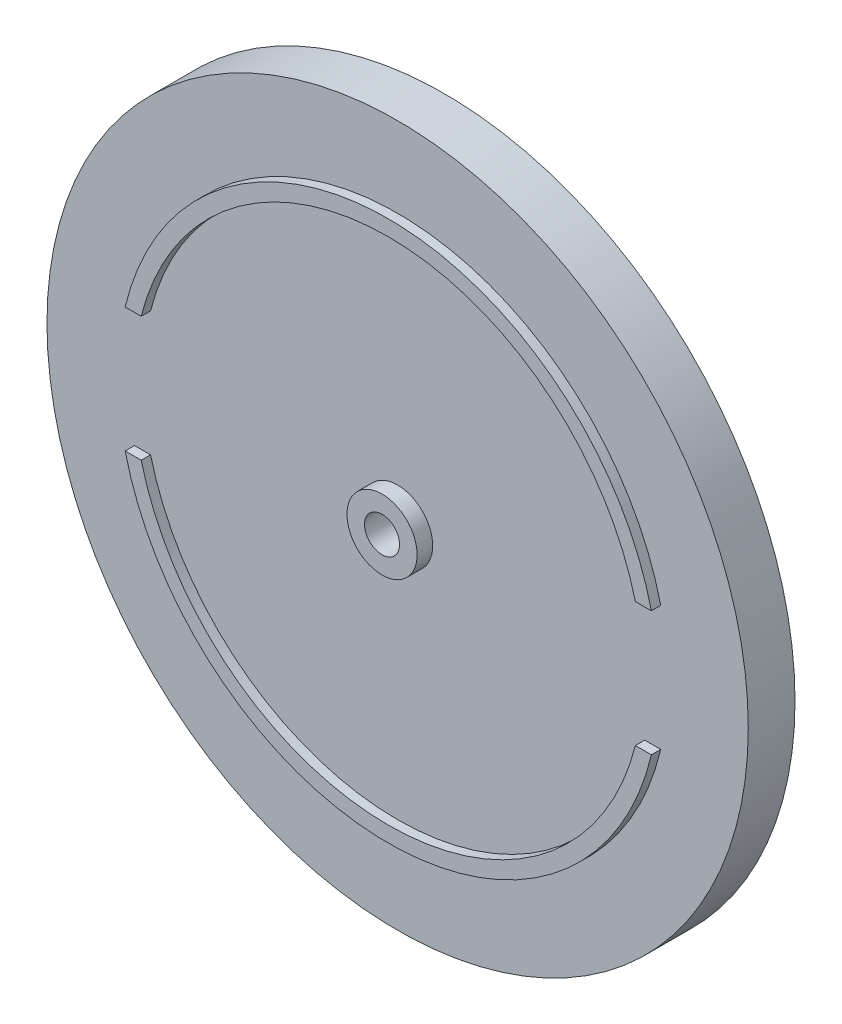
ISO-10303-21;
HEADER;
FILE_DESCRIPTION(('STEP AP214'),'2;1');
FILE_NAME('part.step','',(''),(''),'','','');
FILE_SCHEMA(('AUTOMOTIVE_DESIGN { 1 0 10303 214 1 1 1 1 }'));
ENDSEC;
DATA;
#1=APPLICATION_CONTEXT('core data for automotive mechanical design processes');
#2=APPLICATION_PROTOCOL_DEFINITION('international standard','automotive_design',2000,#1);
#3=PRODUCT_CONTEXT('',#1,'mechanical');
#4=PRODUCT('Part','Part','',(#3));
#5=PRODUCT_RELATED_PRODUCT_CATEGORY('part','',(#4));
#6=PRODUCT_DEFINITION_FORMATION('','',#4);
#7=PRODUCT_DEFINITION_CONTEXT('part definition',#1,'design');
#8=PRODUCT_DEFINITION('design','',#6,#7);
#9=PRODUCT_DEFINITION_SHAPE('','',#8);
#10=(LENGTH_UNIT() NAMED_UNIT(*) SI_UNIT(.MILLI.,.METRE.));
#11=(NAMED_UNIT(*) PLANE_ANGLE_UNIT() SI_UNIT($,.RADIAN.));
#12=(NAMED_UNIT(*) SI_UNIT($,.STERADIAN.) SOLID_ANGLE_UNIT());
#13=UNCERTAINTY_MEASURE_WITH_UNIT(LENGTH_MEASURE(1.E-05),#10,'distance_accuracy_value','');
#14=(GEOMETRIC_REPRESENTATION_CONTEXT(3) GLOBAL_UNCERTAINTY_ASSIGNED_CONTEXT((#13)) GLOBAL_UNIT_ASSIGNED_CONTEXT((#10,
#11,#12)) REPRESENTATION_CONTEXT('',''));
#15=CARTESIAN_POINT('',(0.,0.,0.));
#16=DIRECTION('',(0.,0.,1.));
#17=DIRECTION('',(1.,0.,0.));
#18=AXIS2_PLACEMENT_3D('',#15,#16,#17);
#19=CARTESIAN_POINT('',(0.,0.,-1.));
#20=DIRECTION('',(0.,0.,1.));
#21=DIRECTION('',(1.,0.,0.));
#22=AXIS2_PLACEMENT_3D('',#19,#20,#21);
#23=CYLINDRICAL_SURFACE('',#22,2.25);
#24=CARTESIAN_POINT('',(0.,0.,8.));
#25=DIRECTION('',(0.,0.,1.));
#26=DIRECTION('',(1.,0.,0.));
#27=AXIS2_PLACEMENT_3D('',#24,#25,#26);
#28=CIRCLE('',#27,2.25);
#29=CARTESIAN_POINT('',(2.25,0.,8.));
#30=VERTEX_POINT('',#29);
#31=EDGE_CURVE('E22',#30,#30,#28,.T.);
#32=ORIENTED_EDGE('',*,*,#31,.T.);
#33=EDGE_LOOP('',(#32));
#34=FACE_BOUND('',#33,.T.);
#35=CARTESIAN_POINT('',(0.,0.,4.2));
#36=DIRECTION('',(0.,0.,1.));
#37=DIRECTION('',(1.,0.,0.));
#38=AXIS2_PLACEMENT_3D('',#35,#36,#37);
#39=CIRCLE('',#38,2.25);
#40=CARTESIAN_POINT('',(2.25,0.,4.2));
#41=VERTEX_POINT('',#40);
#42=EDGE_CURVE('E9',#41,#41,#39,.T.);
#43=ORIENTED_EDGE('',*,*,#42,.F.);
#44=EDGE_LOOP('',(#43));
#45=FACE_BOUND('',#44,.T.);
#46=ADVANCED_FACE('F14',(#34,#45),#23,.F.);
#47=CARTESIAN_POINT('',(0.,0.,4.2));
#48=DIRECTION('',(0.,0.,1.));
#49=DIRECTION('',(1.,0.,0.));
#50=AXIS2_PLACEMENT_3D('',#47,#48,#49);
#51=PLANE('',#50);
#52=ORIENTED_EDGE('',*,*,#42,.T.);
#53=EDGE_LOOP('',(#52));
#54=FACE_BOUND('',#53,.T.);
#55=CARTESIAN_POINT('',(0.,0.,4.2));
#56=DIRECTION('',(0.,0.,1.));
#57=DIRECTION('',(1.,0.,0.));
#58=AXIS2_PLACEMENT_3D('',#55,#56,#57);
#59=CIRCLE('',#58,4.7);
#60=CARTESIAN_POINT('',(4.7,0.,4.2));
#61=VERTEX_POINT('',#60);
#62=EDGE_CURVE('E201',#61,#61,#59,.T.);
#63=ORIENTED_EDGE('',*,*,#62,.F.);
#64=EDGE_LOOP('',(#63));
#65=FACE_BOUND('',#64,.T.);
#66=ADVANCED_FACE('F276',(#54,#65),#51,.F.);
#67=CARTESIAN_POINT('',(0.,0.,7.2));
#68=DIRECTION('',(0.,0.,1.));
#69=DIRECTION('',(1.,0.,0.));
#70=AXIS2_PLACEMENT_3D('',#67,#68,#69);
#71=PLANE('',#70);
#72=DIRECTION('',(-1.,0.,0.));
#73=VECTOR('',#72,1.);
#74=CARTESIAN_POINT('',(-20.,8.,7.2));
#75=LINE('',#74,#73);
#76=CARTESIAN_POINT('',(33.765218790939,8.,7.2));
#77=VERTEX_POINT('',#76);
#78=CARTESIAN_POINT('',(31.706308520545,8.,7.2));
#79=VERTEX_POINT('',#78);
#80=EDGE_CURVE('E196',#77,#79,#75,.T.);
#81=ORIENTED_EDGE('',*,*,#80,.F.);
#82=CARTESIAN_POINT('',(0.,0.,7.2));
#83=DIRECTION('',(0.,0.,1.));
#84=DIRECTION('',(1.,0.,0.));
#85=AXIS2_PLACEMENT_3D('',#82,#83,#84);
#86=CIRCLE('',#85,34.7);
#87=CARTESIAN_POINT('',(-33.76521879093,8.,7.2));
#88=VERTEX_POINT('',#87);
#89=EDGE_CURVE('E137',#77,#88,#86,.T.);
#90=ORIENTED_EDGE('',*,*,#89,.T.);
#91=DIRECTION('',(-1.,0.,0.));
#92=VECTOR('',#91,1.);
#93=CARTESIAN_POINT('',(-20.,8.,7.2));
#94=LINE('',#93,#92);
#95=CARTESIAN_POINT('',(-31.70630852054,8.,7.2));
#96=VERTEX_POINT('',#95);
#97=EDGE_CURVE('E208',#96,#88,#94,.T.);
#98=ORIENTED_EDGE('',*,*,#97,.F.);
#99=CARTESIAN_POINT('',(0.,0.,7.2));
#100=DIRECTION('',(0.,0.,1.));
#101=DIRECTION('',(1.,0.,0.));
#102=AXIS2_PLACEMENT_3D('',#99,#100,#101);
#103=CIRCLE('',#102,32.7);
#104=EDGE_CURVE('E34',#79,#96,#103,.T.);
#105=ORIENTED_EDGE('',*,*,#104,.F.);
#106=EDGE_LOOP('',(#81,#90,#98,#105));
#107=FACE_BOUND('',#106,.T.);
#108=ADVANCED_FACE('F222',(#107),#71,.T.);
#109=CARTESIAN_POINT('',(0.,0.,8.));
#110=DIRECTION('',(0.,0.,1.));
#111=DIRECTION('',(1.,0.,0.));
#112=AXIS2_PLACEMENT_3D('',#109,#110,#111);
#113=PLANE('',#112);
#114=ORIENTED_EDGE('',*,*,#31,.F.);
#115=EDGE_LOOP('',(#114));
#116=FACE_BOUND('',#115,.T.);
#117=CARTESIAN_POINT('',(0.,0.,8.));
#118=DIRECTION('',(0.,0.,1.));
#119=DIRECTION('',(1.,0.,0.));
#120=AXIS2_PLACEMENT_3D('',#117,#118,#119);
#121=CIRCLE('',#120,4.5);
#122=CARTESIAN_POINT('',(4.5,0.,8.));
#123=VERTEX_POINT('',#122);
#124=EDGE_CURVE('E134',#123,#123,#121,.T.);
#125=ORIENTED_EDGE('',*,*,#124,.T.);
#126=EDGE_LOOP('',(#125));
#127=FACE_BOUND('',#126,.T.);
#128=ADVANCED_FACE('F219',(#116,#127),#113,.T.);
#129=CARTESIAN_POINT('',(0.,0.,7.2));
#130=DIRECTION('',(0.,0.,1.));
#131=DIRECTION('',(1.,0.,0.));
#132=AXIS2_PLACEMENT_3D('',#129,#130,#131);
#133=PLANE('',#132);
#134=CARTESIAN_POINT('',(0.,0.,7.2));
#135=DIRECTION('',(0.,0.,1.));
#136=DIRECTION('',(1.,0.,0.));
#137=AXIS2_PLACEMENT_3D('',#134,#135,#136);
#138=CIRCLE('',#137,34.7);
#139=CARTESIAN_POINT('',(-33.76521879093,-8.,7.2));
#140=VERTEX_POINT('',#139);
#141=CARTESIAN_POINT('',(33.765218790939,-8.,7.2));
#142=VERTEX_POINT('',#141);
#143=EDGE_CURVE('E103',#140,#142,#138,.T.);
#144=ORIENTED_EDGE('',*,*,#143,.T.);
#145=DIRECTION('',(-1.,0.,0.));
#146=VECTOR('',#145,1.);
#147=CARTESIAN_POINT('',(-20.,-8.,7.2));
#148=LINE('',#147,#146);
#149=CARTESIAN_POINT('',(31.706308520545,-8.,7.2));
#150=VERTEX_POINT('',#149);
#151=EDGE_CURVE('E154',#142,#150,#148,.T.);
#152=ORIENTED_EDGE('',*,*,#151,.T.);
#153=CARTESIAN_POINT('',(0.,0.,7.2));
#154=DIRECTION('',(0.,0.,1.));
#155=DIRECTION('',(1.,0.,0.));
#156=AXIS2_PLACEMENT_3D('',#153,#154,#155);
#157=CIRCLE('',#156,32.7);
#158=CARTESIAN_POINT('',(-31.70630852054,-8.,7.2));
#159=VERTEX_POINT('',#158);
#160=EDGE_CURVE('E105',#159,#150,#157,.T.);
#161=ORIENTED_EDGE('',*,*,#160,.F.);
#162=DIRECTION('',(-1.,0.,0.));
#163=VECTOR('',#162,1.);
#164=CARTESIAN_POINT('',(-20.,-8.,7.2));
#165=LINE('',#164,#163);
#166=EDGE_CURVE('E98',#159,#140,#165,.T.);
#167=ORIENTED_EDGE('',*,*,#166,.T.);
#168=EDGE_LOOP('',(#144,#152,#161,#167));
#169=FACE_BOUND('',#168,.T.);
#170=ADVANCED_FACE('F100',(#169),#133,.T.);
#171=CARTESIAN_POINT('',(0.,0.,-0.1));
#172=DIRECTION('',(0.,0.,1.));
#173=DIRECTION('',(1.,0.,0.));
#174=AXIS2_PLACEMENT_3D('',#171,#172,#173);
#175=CYLINDRICAL_SURFACE('',#174,4.7);
#176=ORIENTED_EDGE('',*,*,#62,.T.);
#177=EDGE_LOOP('',(#176));
#178=FACE_BOUND('',#177,.T.);
#179=CARTESIAN_POINT('',(0.,0.,0.));
#180=DIRECTION('',(0.,0.,1.));
#181=DIRECTION('',(1.,0.,0.));
#182=AXIS2_PLACEMENT_3D('',#179,#180,#181);
#183=CIRCLE('',#182,4.7);
#184=CARTESIAN_POINT('',(4.7,0.,0.));
#185=VERTEX_POINT('',#184);
#186=EDGE_CURVE('E129',#185,#185,#183,.T.);
#187=ORIENTED_EDGE('',*,*,#186,.F.);
#188=EDGE_LOOP('',(#187));
#189=FACE_BOUND('',#188,.T.);
#190=ADVANCED_FACE('F289',(#178,#189),#175,.F.);
#191=CARTESIAN_POINT('',(0.,0.,5.9));
#192=DIRECTION('',(0.,0.,1.));
#193=DIRECTION('',(1.,0.,0.));
#194=AXIS2_PLACEMENT_3D('',#191,#192,#193);
#195=CYLINDRICAL_SURFACE('',#194,32.7);
#196=DIRECTION('',(0.,0.,1.));
#197=VECTOR('',#196,1.);
#198=CARTESIAN_POINT('',(-31.70630852054,8.,5.9));
#199=LINE('',#198,#197);
#200=CARTESIAN_POINT('',(-31.70630852054,8.,6.));
#201=VERTEX_POINT('',#200);
#202=EDGE_CURVE('E207',#201,#96,#199,.T.);
#203=ORIENTED_EDGE('',*,*,#202,.F.);
#204=CARTESIAN_POINT('',(0.,0.,6.));
#205=DIRECTION('',(0.,0.,1.));
#206=DIRECTION('',(1.,0.,0.));
#207=AXIS2_PLACEMENT_3D('',#204,#205,#206);
#208=CIRCLE('',#207,32.7);
#209=CARTESIAN_POINT('',(31.706308520545,8.,6.));
#210=VERTEX_POINT('',#209);
#211=EDGE_CURVE('E159',#210,#201,#208,.T.);
#212=ORIENTED_EDGE('',*,*,#211,.F.);
#213=DIRECTION('',(0.,0.,1.));
#214=VECTOR('',#213,1.);
#215=CARTESIAN_POINT('',(31.706308520545,8.,5.9));
#216=LINE('',#215,#214);
#217=EDGE_CURVE('E200',#210,#79,#216,.T.);
#218=ORIENTED_EDGE('',*,*,#217,.T.);
#219=ORIENTED_EDGE('',*,*,#104,.T.);
#220=EDGE_LOOP('',(#203,#212,#218,#219));
#221=FACE_BOUND('',#220,.T.);
#222=ADVANCED_FACE('F259',(#221),#195,.F.);
#223=CARTESIAN_POINT('',(-40.,8.,5.9));
#224=DIRECTION('',(0.,1.,0.));
#225=DIRECTION('',(1.,0.,0.));
#226=AXIS2_PLACEMENT_3D('',#223,#224,#225);
#227=PLANE('',#226);
#228=ORIENTED_EDGE('',*,*,#202,.T.);
#229=ORIENTED_EDGE('',*,*,#97,.T.);
#230=DIRECTION('',(0.,0.,1.));
#231=VECTOR('',#230,1.);
#232=CARTESIAN_POINT('',(-33.76521879093,8.,6.));
#233=LINE('',#232,#231);
#234=CARTESIAN_POINT('',(-33.76521879093,8.,6.));
#235=VERTEX_POINT('',#234);
#236=EDGE_CURVE('E192',#235,#88,#233,.T.);
#237=ORIENTED_EDGE('',*,*,#236,.F.);
#238=DIRECTION('',(-1.,0.,0.));
#239=VECTOR('',#238,1.);
#240=CARTESIAN_POINT('',(-20.,8.,6.));
#241=LINE('',#240,#239);
#242=EDGE_CURVE('E163',#201,#235,#241,.T.);
#243=ORIENTED_EDGE('',*,*,#242,.F.);
#244=EDGE_LOOP('',(#228,#229,#237,#243));
#245=FACE_BOUND('',#244,.T.);
#246=ADVANCED_FACE('F257',(#245),#227,.F.);
#247=CARTESIAN_POINT('',(-40.,8.,5.9));
#248=DIRECTION('',(0.,1.,0.));
#249=DIRECTION('',(1.,0.,0.));
#250=AXIS2_PLACEMENT_3D('',#247,#248,#249);
#251=PLANE('',#250);
#252=ORIENTED_EDGE('',*,*,#80,.T.);
#253=ORIENTED_EDGE('',*,*,#217,.F.);
#254=DIRECTION('',(-1.,0.,0.));
#255=VECTOR('',#254,1.);
#256=CARTESIAN_POINT('',(-20.,8.,6.));
#257=LINE('',#256,#255);
#258=CARTESIAN_POINT('',(33.765218790939,8.,6.));
#259=VERTEX_POINT('',#258);
#260=EDGE_CURVE('E164',#259,#210,#257,.T.);
#261=ORIENTED_EDGE('',*,*,#260,.F.);
#262=DIRECTION('',(0.,0.,1.));
#263=VECTOR('',#262,1.);
#264=CARTESIAN_POINT('',(33.765218790939,8.,6.));
#265=LINE('',#264,#263);
#266=EDGE_CURVE('E188',#259,#77,#265,.T.);
#267=ORIENTED_EDGE('',*,*,#266,.T.);
#268=EDGE_LOOP('',(#252,#253,#261,#267));
#269=FACE_BOUND('',#268,.T.);
#270=ADVANCED_FACE('F263',(#269),#251,.F.);
#271=CARTESIAN_POINT('',(0.,0.,6.));
#272=DIRECTION('',(0.,0.,1.));
#273=DIRECTION('',(1.,0.,0.));
#274=AXIS2_PLACEMENT_3D('',#271,#272,#273);
#275=CYLINDRICAL_SURFACE('',#274,34.7);
#276=ORIENTED_EDGE('',*,*,#89,.F.);
#277=ORIENTED_EDGE('',*,*,#266,.F.);
#278=CARTESIAN_POINT('',(0.,0.,6.));
#279=DIRECTION('',(0.,0.,1.));
#280=DIRECTION('',(1.,0.,0.));
#281=AXIS2_PLACEMENT_3D('',#278,#279,#280);
#282=CIRCLE('',#281,34.7);
#283=EDGE_CURVE('E158',#259,#235,#282,.T.);
#284=ORIENTED_EDGE('',*,*,#283,.T.);
#285=ORIENTED_EDGE('',*,*,#236,.T.);
#286=EDGE_LOOP('',(#276,#277,#284,#285));
#287=FACE_BOUND('',#286,.T.);
#288=ADVANCED_FACE('F230',(#287),#275,.T.);
#289=CARTESIAN_POINT('',(0.,0.,6.));
#290=DIRECTION('',(0.,0.,1.));
#291=DIRECTION('',(1.,0.,0.));
#292=AXIS2_PLACEMENT_3D('',#289,#290,#291);
#293=CYLINDRICAL_SURFACE('',#292,4.5);
#294=ORIENTED_EDGE('',*,*,#124,.F.);
#295=EDGE_LOOP('',(#294));
#296=FACE_BOUND('',#295,.T.);
#297=CARTESIAN_POINT('',(0.,0.,6.));
#298=DIRECTION('',(0.,0.,1.));
#299=DIRECTION('',(1.,0.,0.));
#300=AXIS2_PLACEMENT_3D('',#297,#298,#299);
#301=CIRCLE('',#300,4.5);
#302=CARTESIAN_POINT('',(4.5,0.,6.));
#303=VERTEX_POINT('',#302);
#304=EDGE_CURVE('E145',#303,#303,#301,.T.);
#305=ORIENTED_EDGE('',*,*,#304,.T.);
#306=EDGE_LOOP('',(#305));
#307=FACE_BOUND('',#306,.T.);
#308=ADVANCED_FACE('F226',(#296,#307),#293,.T.);
#309=CARTESIAN_POINT('',(0.,0.,5.9));
#310=DIRECTION('',(0.,0.,1.));
#311=DIRECTION('',(1.,0.,0.));
#312=AXIS2_PLACEMENT_3D('',#309,#310,#311);
#313=CYLINDRICAL_SURFACE('',#312,32.7);
#314=CARTESIAN_POINT('',(0.,0.,6.));
#315=DIRECTION('',(0.,0.,1.));
#316=DIRECTION('',(1.,0.,0.));
#317=AXIS2_PLACEMENT_3D('',#314,#315,#316);
#318=CIRCLE('',#317,32.7);
#319=CARTESIAN_POINT('',(-31.70630852054,-8.,6.));
#320=VERTEX_POINT('',#319);
#321=CARTESIAN_POINT('',(31.706308520545,-8.,6.));
#322=VERTEX_POINT('',#321);
#323=EDGE_CURVE('E146',#320,#322,#318,.T.);
#324=ORIENTED_EDGE('',*,*,#323,.F.);
#325=DIRECTION('',(0.,0.,1.));
#326=VECTOR('',#325,1.);
#327=CARTESIAN_POINT('',(-31.70630852054,-8.,5.9));
#328=LINE('',#327,#326);
#329=EDGE_CURVE('E109',#320,#159,#328,.T.);
#330=ORIENTED_EDGE('',*,*,#329,.T.);
#331=ORIENTED_EDGE('',*,*,#160,.T.);
#332=DIRECTION('',(0.,0.,1.));
#333=VECTOR('',#332,1.);
#334=CARTESIAN_POINT('',(31.706308520545,-8.,5.9));
#335=LINE('',#334,#333);
#336=EDGE_CURVE('E179',#322,#150,#335,.T.);
#337=ORIENTED_EDGE('',*,*,#336,.F.);
#338=EDGE_LOOP('',(#324,#330,#331,#337));
#339=FACE_BOUND('',#338,.T.);
#340=ADVANCED_FACE('F229',(#339),#313,.F.);
#341=CARTESIAN_POINT('',(-40.,-8.,5.9));
#342=DIRECTION('',(0.,1.,0.));
#343=DIRECTION('',(1.,0.,0.));
#344=AXIS2_PLACEMENT_3D('',#341,#342,#343);
#345=PLANE('',#344);
#346=DIRECTION('',(0.,0.,1.));
#347=VECTOR('',#346,1.);
#348=CARTESIAN_POINT('',(33.765218790939,-8.,6.));
#349=LINE('',#348,#347);
#350=CARTESIAN_POINT('',(33.765218790939,-8.,6.));
#351=VERTEX_POINT('',#350);
#352=EDGE_CURVE('E122',#351,#142,#349,.T.);
#353=ORIENTED_EDGE('',*,*,#352,.F.);
#354=DIRECTION('',(-1.,0.,0.));
#355=VECTOR('',#354,1.);
#356=CARTESIAN_POINT('',(-20.,-8.,6.));
#357=LINE('',#356,#355);
#358=EDGE_CURVE('E141',#351,#322,#357,.T.);
#359=ORIENTED_EDGE('',*,*,#358,.T.);
#360=ORIENTED_EDGE('',*,*,#336,.T.);
#361=ORIENTED_EDGE('',*,*,#151,.F.);
#362=EDGE_LOOP('',(#353,#359,#360,#361));
#363=FACE_BOUND('',#362,.T.);
#364=ADVANCED_FACE('F295',(#363),#345,.T.);
#365=CARTESIAN_POINT('',(-40.,-8.,5.9));
#366=DIRECTION('',(0.,1.,0.));
#367=DIRECTION('',(1.,0.,0.));
#368=AXIS2_PLACEMENT_3D('',#365,#366,#367);
#369=PLANE('',#368);
#370=DIRECTION('',(-1.,0.,0.));
#371=VECTOR('',#370,1.);
#372=CARTESIAN_POINT('',(-20.,-8.,6.));
#373=LINE('',#372,#371);
#374=CARTESIAN_POINT('',(-33.76521879093,-8.,6.));
#375=VERTEX_POINT('',#374);
#376=EDGE_CURVE('E115',#320,#375,#373,.T.);
#377=ORIENTED_EDGE('',*,*,#376,.T.);
#378=DIRECTION('',(0.,0.,1.));
#379=VECTOR('',#378,1.);
#380=CARTESIAN_POINT('',(-33.76521879093,-8.,6.));
#381=LINE('',#380,#379);
#382=EDGE_CURVE('E110',#375,#140,#381,.T.);
#383=ORIENTED_EDGE('',*,*,#382,.T.);
#384=ORIENTED_EDGE('',*,*,#166,.F.);
#385=ORIENTED_EDGE('',*,*,#329,.F.);
#386=EDGE_LOOP('',(#377,#383,#384,#385));
#387=FACE_BOUND('',#386,.T.);
#388=ADVANCED_FACE('F113',(#387),#369,.T.);
#389=CARTESIAN_POINT('',(0.,0.,6.));
#390=DIRECTION('',(0.,0.,1.));
#391=DIRECTION('',(1.,0.,0.));
#392=AXIS2_PLACEMENT_3D('',#389,#390,#391);
#393=CYLINDRICAL_SURFACE('',#392,34.7);
#394=ORIENTED_EDGE('',*,*,#352,.T.);
#395=ORIENTED_EDGE('',*,*,#143,.F.);
#396=ORIENTED_EDGE('',*,*,#382,.F.);
#397=CARTESIAN_POINT('',(0.,0.,6.));
#398=DIRECTION('',(0.,0.,1.));
#399=DIRECTION('',(1.,0.,0.));
#400=AXIS2_PLACEMENT_3D('',#397,#398,#399);
#401=CIRCLE('',#400,34.7);
#402=EDGE_CURVE('E138',#375,#351,#401,.T.);
#403=ORIENTED_EDGE('',*,*,#402,.T.);
#404=EDGE_LOOP('',(#394,#395,#396,#403));
#405=FACE_BOUND('',#404,.T.);
#406=ADVANCED_FACE('F121',(#405),#393,.T.);
#407=CARTESIAN_POINT('',(0.,0.,0.));
#408=DIRECTION('',(0.,0.,1.));
#409=DIRECTION('',(1.,0.,0.));
#410=AXIS2_PLACEMENT_3D('',#407,#408,#409);
#411=PLANE('',#410);
#412=ORIENTED_EDGE('',*,*,#186,.T.);
#413=EDGE_LOOP('',(#412));
#414=FACE_BOUND('',#413,.T.);
#415=CARTESIAN_POINT('',(0.,0.,0.));
#416=DIRECTION('',(0.,0.,1.));
#417=DIRECTION('',(1.,0.,0.));
#418=AXIS2_PLACEMENT_3D('',#415,#416,#417);
#419=CIRCLE('',#418,45.);
#420=CARTESIAN_POINT('',(45.,0.,0.));
#421=VERTEX_POINT('',#420);
#422=EDGE_CURVE('E133',#421,#421,#419,.T.);
#423=ORIENTED_EDGE('',*,*,#422,.F.);
#424=EDGE_LOOP('',(#423));
#425=FACE_BOUND('',#424,.T.);
#426=ADVANCED_FACE('F238',(#414,#425),#411,.F.);
#427=CARTESIAN_POINT('',(0.,0.,6.));
#428=DIRECTION('',(0.,0.,1.));
#429=DIRECTION('',(1.,0.,0.));
#430=AXIS2_PLACEMENT_3D('',#427,#428,#429);
#431=PLANE('',#430);
#432=ORIENTED_EDGE('',*,*,#283,.F.);
#433=ORIENTED_EDGE('',*,*,#260,.T.);
#434=ORIENTED_EDGE('',*,*,#211,.T.);
#435=ORIENTED_EDGE('',*,*,#242,.T.);
#436=EDGE_LOOP('',(#432,#433,#434,#435));
#437=FACE_BOUND('',#436,.T.);
#438=ORIENTED_EDGE('',*,*,#304,.F.);
#439=EDGE_LOOP('',(#438));
#440=FACE_BOUND('',#439,.T.);
#441=ORIENTED_EDGE('',*,*,#402,.F.);
#442=ORIENTED_EDGE('',*,*,#376,.F.);
#443=ORIENTED_EDGE('',*,*,#323,.T.);
#444=ORIENTED_EDGE('',*,*,#358,.F.);
#445=EDGE_LOOP('',(#441,#442,#443,#444));
#446=FACE_BOUND('',#445,.T.);
#447=CARTESIAN_POINT('',(0.,0.,6.));
#448=DIRECTION('',(0.,0.,1.));
#449=DIRECTION('',(1.,0.,0.));
#450=AXIS2_PLACEMENT_3D('',#447,#448,#449);
#451=CIRCLE('',#450,45.);
#452=CARTESIAN_POINT('',(45.,0.,6.));
#453=VERTEX_POINT('',#452);
#454=EDGE_CURVE('E245',#453,#453,#451,.T.);
#455=ORIENTED_EDGE('',*,*,#454,.T.);
#456=EDGE_LOOP('',(#455));
#457=FACE_BOUND('',#456,.T.);
#458=ADVANCED_FACE('F234',(#437,#440,#446,#457),#431,.T.);
#459=CARTESIAN_POINT('',(0.,0.,0.));
#460=DIRECTION('',(0.,0.,1.));
#461=DIRECTION('',(1.,0.,0.));
#462=AXIS2_PLACEMENT_3D('',#459,#460,#461);
#463=CYLINDRICAL_SURFACE('',#462,45.);
#464=ORIENTED_EDGE('',*,*,#454,.F.);
#465=EDGE_LOOP('',(#464));
#466=FACE_BOUND('',#465,.T.);
#467=ORIENTED_EDGE('',*,*,#422,.T.);
#468=EDGE_LOOP('',(#467));
#469=FACE_BOUND('',#468,.T.);
#470=ADVANCED_FACE('F237',(#466,#469),#463,.T.);
#471=CLOSED_SHELL('',(#46,#66,#108,#128,#170,#190,#222,#246,#270,#288,#308,#340,#364,#388,#406,
#426,#458,#470));
#472=MANIFOLD_SOLID_BREP('B1',#471);
#473=ADVANCED_BREP_SHAPE_REPRESENTATION('',(#18,#472),#14);
#474=SHAPE_DEFINITION_REPRESENTATION(#9,#473);
ENDSEC;
END-ISO-10303-21;
